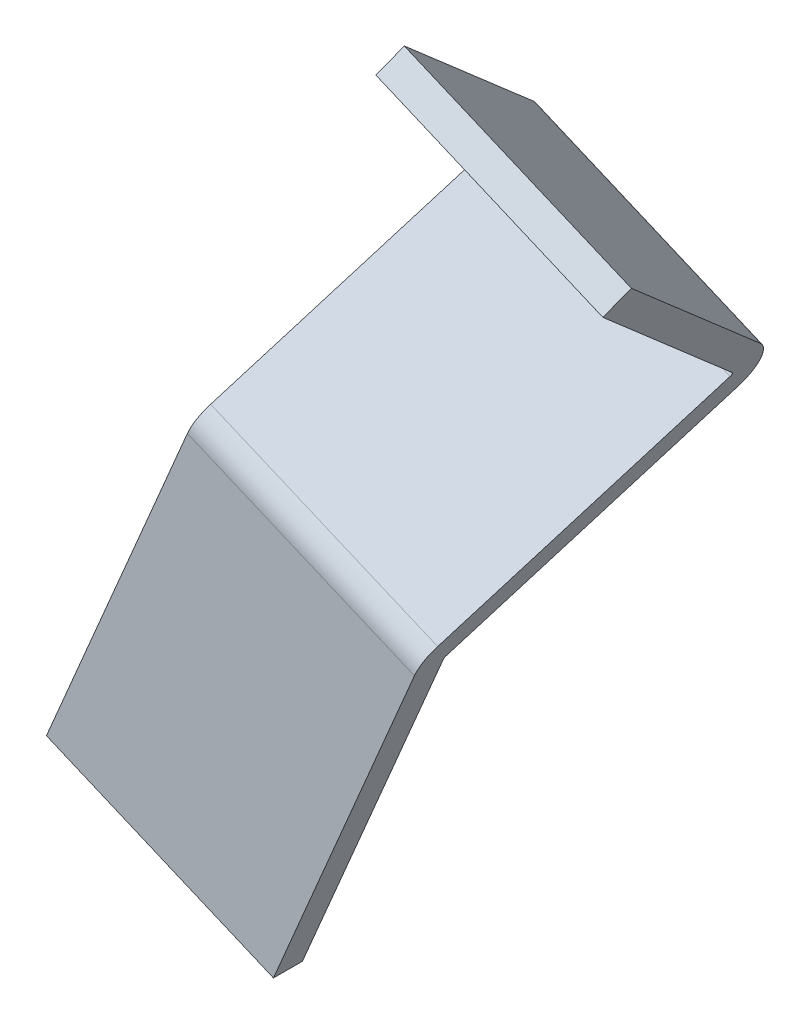
ISO-10303-21;
HEADER;
FILE_DESCRIPTION(('STEP AP214'),'2;1');
FILE_NAME('part.step','',(''),(''),'','','');
FILE_SCHEMA(('AUTOMOTIVE_DESIGN { 1 0 10303 214 1 1 1 1 }'));
ENDSEC;
DATA;
#1=APPLICATION_CONTEXT('core data for automotive mechanical design processes');
#2=APPLICATION_PROTOCOL_DEFINITION('international standard','automotive_design',2000,#1);
#3=PRODUCT_CONTEXT('',#1,'mechanical');
#4=PRODUCT('Part','Part','',(#3));
#5=PRODUCT_RELATED_PRODUCT_CATEGORY('part','',(#4));
#6=PRODUCT_DEFINITION_FORMATION('','',#4);
#7=PRODUCT_DEFINITION_CONTEXT('part definition',#1,'design');
#8=PRODUCT_DEFINITION('design','',#6,#7);
#9=PRODUCT_DEFINITION_SHAPE('','',#8);
#10=(LENGTH_UNIT() NAMED_UNIT(*) SI_UNIT(.MILLI.,.METRE.));
#11=(NAMED_UNIT(*) PLANE_ANGLE_UNIT() SI_UNIT($,.RADIAN.));
#12=(NAMED_UNIT(*) SI_UNIT($,.STERADIAN.) SOLID_ANGLE_UNIT());
#13=UNCERTAINTY_MEASURE_WITH_UNIT(LENGTH_MEASURE(1.E-05),#10,'distance_accuracy_value','');
#14=(GEOMETRIC_REPRESENTATION_CONTEXT(3) GLOBAL_UNCERTAINTY_ASSIGNED_CONTEXT((#13)) GLOBAL_UNIT_ASSIGNED_CONTEXT((#10,
#11,#12)) REPRESENTATION_CONTEXT('',''));
#15=CARTESIAN_POINT('',(0.,0.,0.));
#16=DIRECTION('',(0.,0.,1.));
#17=DIRECTION('',(1.,0.,0.));
#18=AXIS2_PLACEMENT_3D('',#15,#16,#17);
#19=CARTESIAN_POINT('',(31.5081880786191,28.9458657228669,-7.62197859128224));
#20=DIRECTION('',(-0.276231828199763,-0.650919332244334,0.707106781186552));
#21=DIRECTION('',(0.,-0.735733406737757,-0.677271256004605));
#22=AXIS2_PLACEMENT_3D('',#19,#20,#21);
#23=PLANE('',#22);
#24=DIRECTION('',(-0.27623182819976,-0.650919332244342,-0.707106781186546));
#25=VECTOR('',#24,1.);
#26=CARTESIAN_POINT('',(32.2424553181626,30.6761107289089,-5.74237859128224));
#27=LINE('',#26,#25);
#28=CARTESIAN_POINT('',(32.2424553181626,30.6761107289089,-5.74237859128223));
#29=VERTEX_POINT('',#28);
#30=CARTESIAN_POINT('',(31.5164030968905,28.9652237897573,-7.60094953331634));
#31=VERTEX_POINT('',#30);
#32=EDGE_CURVE('E105',#29,#31,#27,.T.);
#33=ORIENTED_EDGE('',*,*,#32,.F.);
#34=DIRECTION('',(-0.920538947670782,0.390650797799224,0.));
#35=VECTOR('',#34,1.);
#36=CARTESIAN_POINT('',(32.2424553181626,30.6761107289089,-5.74237859128223));
#37=LINE('',#36,#35);
#38=CARTESIAN_POINT('',(30.2550117301413,31.5195258013574,-5.74237859128224));
#39=VERTEX_POINT('',#38);
#40=EDGE_CURVE('E207',#29,#39,#37,.T.);
#41=ORIENTED_EDGE('',*,*,#40,.T.);
#42=DIRECTION('',(0.276231828199762,0.650919332244341,0.707106781186547));
#43=VECTOR('',#42,1.);
#44=CARTESIAN_POINT('',(29.5289595088692,29.8086388622058,-7.60094953331638));
#45=LINE('',#44,#43);
#46=CARTESIAN_POINT('',(29.5289595088692,29.8086388622058,-7.60094953331638));
#47=VERTEX_POINT('',#46);
#48=EDGE_CURVE('E213',#47,#39,#45,.T.);
#49=ORIENTED_EDGE('',*,*,#48,.F.);
#50=DIRECTION('',(-0.920538947670799,0.390650797799183,0.));
#51=VECTOR('',#50,1.);
#52=CARTESIAN_POINT('',(31.5164030968905,28.9652237897573,-7.60094953331632));
#53=LINE('',#52,#51);
#54=EDGE_CURVE('E288',#47,#31,#53,.F.);
#55=ORIENTED_EDGE('',*,*,#54,.T.);
#56=EDGE_LOOP('',(#33,#41,#49,#55));
#57=FACE_BOUND('',#56,.T.);
#58=ADVANCED_FACE('F17',(#57),#23,.T.);
#59=CARTESIAN_POINT('',(32.3126182025253,30.8414442392989,-5.92198371370362));
#60=DIRECTION('',(-0.276231828199762,-0.650919332244339,-0.707106781186549));
#61=DIRECTION('',(0.,0.735733406737752,-0.677271256004609));
#62=AXIS2_PLACEMENT_3D('',#59,#60,#61);
#63=PLANE('',#62);
#64=ORIENTED_EDGE('',*,*,#40,.F.);
#65=DIRECTION('',(-0.276231828199565,-0.650919332244425,0.707106781186546));
#66=VECTOR('',#65,1.);
#67=CARTESIAN_POINT('',(32.3126182025253,30.8414442392989,-5.92198371370362));
#68=LINE('',#67,#66);
#69=CARTESIAN_POINT('',(32.3126182025253,30.8414442392989,-5.92198371370362));
#70=VERTEX_POINT('',#69);
#71=EDGE_CURVE('E209',#70,#29,#68,.T.);
#72=ORIENTED_EDGE('',*,*,#71,.F.);
#73=DIRECTION('',(-0.920538947670783,0.39065079779922,0.));
#74=VECTOR('',#73,1.);
#75=CARTESIAN_POINT('',(32.3126182025253,30.8414442392989,-5.92198371370362));
#76=LINE('',#75,#74);
#77=CARTESIAN_POINT('',(30.3251746145041,31.6848593117474,-5.92198371370362));
#78=VERTEX_POINT('',#77);
#79=EDGE_CURVE('E277',#70,#78,#76,.T.);
#80=ORIENTED_EDGE('',*,*,#79,.T.);
#81=DIRECTION('',(0.276231828199764,0.650919332244325,-0.70710678118656));
#82=VECTOR('',#81,1.);
#83=CARTESIAN_POINT('',(30.2550117301413,31.5195258013574,-5.74237859128224));
#84=LINE('',#83,#82);
#85=EDGE_CURVE('E211',#39,#78,#84,.T.);
#86=ORIENTED_EDGE('',*,*,#85,.F.);
#87=EDGE_LOOP('',(#64,#72,#80,#86));
#88=FACE_BOUND('',#87,.T.);
#89=ADVANCED_FACE('F199',(#88),#63,.F.);
#90=CARTESIAN_POINT('',(31.5093868084542,28.9486904387183,-7.58298902107423));
#91=DIRECTION('',(-0.920538947670799,0.390650797799183,0.));
#92=DIRECTION('',(-0.390650797799183,-0.920538947670799,0.));
#93=AXIS2_PLACEMENT_3D('',#90,#91,#92);
#94=CYLINDRICAL_SURFACE('',#93,0.0253999999999994);
#95=DIRECTION('',(-0.920538947670784,0.390650797799217,0.));
#96=VECTOR('',#95,1.);
#97=CARTESIAN_POINT('',(31.5013593128433,28.9297742547409,-7.59791876648247));
#98=LINE('',#97,#96);
#99=CARTESIAN_POINT('',(31.5013593128434,28.9297742547409,-7.59791876648246));
#100=VERTEX_POINT('',#99);
#101=CARTESIAN_POINT('',(29.5139157248221,29.7731893271894,-7.59791876648247));
#102=VERTEX_POINT('',#101);
#103=EDGE_CURVE('E264',#100,#102,#98,.T.);
#104=ORIENTED_EDGE('',*,*,#103,.F.);
#105=CARTESIAN_POINT('',(31.5093868084542,28.9486904387182,-7.58298902107423));
#106=DIRECTION('',(-0.920538947670799,0.390650797799183,0.));
#107=DIRECTION('',(-0.390650797799183,-0.920538947670799,0.));
#108=AXIS2_PLACEMENT_3D('',#105,#106,#107);
#109=CIRCLE('',#108,0.0253999999999994);
#110=EDGE_CURVE('E20',#31,#100,#109,.T.);
#111=ORIENTED_EDGE('',*,*,#110,.F.);
#112=ORIENTED_EDGE('',*,*,#54,.F.);
#113=CARTESIAN_POINT('',(29.5219432204329,29.7921055111667,-7.58298902107423));
#114=DIRECTION('',(-0.920538947670799,0.390650797799183,0.));
#115=DIRECTION('',(-0.390650797799183,-0.920538947670799,0.));
#116=AXIS2_PLACEMENT_3D('',#113,#114,#115);
#117=CIRCLE('',#116,0.0253999999999994);
#118=EDGE_CURVE('E262',#102,#47,#117,.F.);
#119=ORIENTED_EDGE('',*,*,#118,.F.);
#120=EDGE_LOOP('',(#104,#111,#112,#119));
#121=FACE_BOUND('',#120,.T.);
#122=ADVANCED_FACE('F196',(#121),#94,.F.);
#123=CARTESIAN_POINT('',(31.5783509629819,29.1111992332569,-7.80158371370362));
#124=DIRECTION('',(-0.276231828199763,-0.650919332244334,0.707106781186552));
#125=DIRECTION('',(0.,-0.735733406737757,-0.677271256004605));
#126=AXIS2_PLACEMENT_3D('',#123,#124,#125);
#127=PLANE('',#126);
#128=ORIENTED_EDGE('',*,*,#79,.F.);
#129=DIRECTION('',(0.276231828199753,0.650919332244349,0.707106781186543));
#130=VECTOR('',#129,1.);
#131=CARTESIAN_POINT('',(31.5865659812532,29.1305573001473,-7.78055465573773));
#132=LINE('',#131,#130);
#133=CARTESIAN_POINT('',(31.5865659812532,29.1305573001473,-7.78055465573774));
#134=VERTEX_POINT('',#133);
#135=EDGE_CURVE('E217',#134,#70,#132,.T.);
#136=ORIENTED_EDGE('',*,*,#135,.F.);
#137=DIRECTION('',(-0.920538947670783,0.390650797799221,0.));
#138=VECTOR('',#137,1.);
#139=CARTESIAN_POINT('',(31.5865659812532,29.1305573001473,-7.78055465573775));
#140=LINE('',#139,#138);
#141=CARTESIAN_POINT('',(29.599122393232,29.9739723725958,-7.78055465573775));
#142=VERTEX_POINT('',#141);
#143=EDGE_CURVE('E258',#142,#134,#140,.F.);
#144=ORIENTED_EDGE('',*,*,#143,.F.);
#145=DIRECTION('',(-0.276231828199771,-0.650919332244341,-0.707106781186543));
#146=VECTOR('',#145,1.);
#147=CARTESIAN_POINT('',(30.3251746145041,31.6848593117474,-5.92198371370362));
#148=LINE('',#147,#146);
#149=EDGE_CURVE('E273',#78,#142,#148,.T.);
#150=ORIENTED_EDGE('',*,*,#149,.F.);
#151=EDGE_LOOP('',(#128,#136,#144,#150));
#152=FACE_BOUND('',#151,.T.);
#153=ADVANCED_FACE('F192',(#152),#127,.F.);
#154=CARTESIAN_POINT('',(30.9026202999469,27.5188912257897,-5.48837859128225));
#155=DIRECTION('',(0.316043134285696,0.744731652649689,0.587785252292482));
#156=DIRECTION('',(0.,-0.619539879072761,0.784965182819282));
#157=AXIS2_PLACEMENT_3D('',#154,#155,#156);
#158=PLANE('',#157);
#159=DIRECTION('',(-0.229618777742678,-0.541079217601728,0.809016994374939));
#160=VECTOR('',#159,1.);
#161=CARTESIAN_POINT('',(31.5013593128434,28.9297742547409,-7.59791876648246));
#162=LINE('',#161,#160);
#163=CARTESIAN_POINT('',(30.9353091530439,27.5959200264477,-5.60355139179172));
#164=VERTEX_POINT('',#163);
#165=EDGE_CURVE('E261',#100,#164,#162,.T.);
#166=ORIENTED_EDGE('',*,*,#165,.F.);
#167=ORIENTED_EDGE('',*,*,#103,.T.);
#168=DIRECTION('',(0.229618777742676,0.541079217601727,-0.809016994374941));
#169=VECTOR('',#168,1.);
#170=CARTESIAN_POINT('',(28.9478655650227,28.4393350988962,-5.60355139179173));
#171=LINE('',#170,#169);
#172=CARTESIAN_POINT('',(28.9478655650227,28.4393350988963,-5.60355139179173));
#173=VERTEX_POINT('',#172);
#174=EDGE_CURVE('E254',#173,#102,#171,.T.);
#175=ORIENTED_EDGE('',*,*,#174,.F.);
#176=DIRECTION('',(-0.920538947670783,0.390650797799221,0.));
#177=VECTOR('',#176,1.);
#178=CARTESIAN_POINT('',(30.935309153044,27.5959200264477,-5.60355139179173));
#179=LINE('',#178,#177);
#180=EDGE_CURVE('E250',#164,#173,#179,.T.);
#181=ORIENTED_EDGE('',*,*,#180,.F.);
#182=EDGE_LOOP('',(#166,#167,#175,#181));
#183=FACE_BOUND('',#182,.T.);
#184=ADVANCED_FACE('F188',(#183),#158,.T.);
#185=CARTESIAN_POINT('',(31.5093868084542,28.9486904387183,-7.58298902107423));
#186=DIRECTION('',(-0.920538947670783,0.390650797799221,0.));
#187=DIRECTION('',(-0.390650797799221,-0.920538947670783,0.));
#188=AXIS2_PLACEMENT_3D('',#185,#186,#187);
#189=CYLINDRICAL_SURFACE('',#188,0.279400000000002);
#190=CARTESIAN_POINT('',(31.5093868084542,28.9486904387182,-7.58298902107423));
#191=DIRECTION('',(-0.920538947670783,0.390650797799221,0.));
#192=DIRECTION('',(-0.390650797799221,-0.920538947670783,0.));
#193=AXIS2_PLACEMENT_3D('',#190,#191,#192);
#194=CIRCLE('',#193,0.279400000000002);
#195=CARTESIAN_POINT('',(31.4210843567348,28.7406124149679,-7.74721622056476));
#196=VERTEX_POINT('',#195);
#197=EDGE_CURVE('E255',#134,#196,#194,.T.);
#198=ORIENTED_EDGE('',*,*,#197,.T.);
#199=DIRECTION('',(-0.920538947670785,0.390650797799215,0.));
#200=VECTOR('',#199,1.);
#201=CARTESIAN_POINT('',(31.4210843567348,28.7406124149679,-7.74721622056477));
#202=LINE('',#201,#200);
#203=CARTESIAN_POINT('',(29.4336407687136,29.5840274874164,-7.74721622056476));
#204=VERTEX_POINT('',#203);
#205=EDGE_CURVE('E303',#196,#204,#202,.T.);
#206=ORIENTED_EDGE('',*,*,#205,.T.);
#207=CARTESIAN_POINT('',(29.521943220433,29.7921055111668,-7.58298902107423));
#208=DIRECTION('',(-0.920538947670783,0.390650797799221,0.));
#209=DIRECTION('',(-0.390650797799221,-0.920538947670783,0.));
#210=AXIS2_PLACEMENT_3D('',#207,#208,#209);
#211=CIRCLE('',#210,0.279400000000002);
#212=EDGE_CURVE('E259',#204,#142,#211,.F.);
#213=ORIENTED_EDGE('',*,*,#212,.T.);
#214=ORIENTED_EDGE('',*,*,#143,.T.);
#215=EDGE_LOOP('',(#198,#206,#213,#214));
#216=FACE_BOUND('',#215,.T.);
#217=ADVANCED_FACE('F184',(#216),#189,.T.);
#218=CARTESIAN_POINT('',(30.8470067013245,27.3878420026974,-5.76777859128224));
#219=DIRECTION('',(-0.920538947670783,0.390650797799221,0.));
#220=DIRECTION('',(-0.390650797799221,-0.920538947670783,0.));
#221=AXIS2_PLACEMENT_3D('',#218,#219,#220);
#222=CYLINDRICAL_SURFACE('',#221,0.279400000000002);
#223=CARTESIAN_POINT('',(30.8470067013245,27.3878420026974,-5.76777859128224));
#224=DIRECTION('',(-0.920538947670783,0.390650797799221,0.));
#225=DIRECTION('',(-0.390650797799221,-0.920538947670783,0.));
#226=AXIS2_PLACEMENT_3D('',#223,#224,#225);
#227=CIRCLE('',#226,0.279400000000002);
#228=CARTESIAN_POINT('',(30.8470067013245,27.3878420026974,-5.48837859128225));
#229=VERTEX_POINT('',#228);
#230=EDGE_CURVE('E246',#164,#229,#227,.F.);
#231=ORIENTED_EDGE('',*,*,#230,.F.);
#232=ORIENTED_EDGE('',*,*,#180,.T.);
#233=CARTESIAN_POINT('',(28.8595631133033,28.2312570751459,-5.76777859128224));
#234=DIRECTION('',(-0.920538947670783,0.390650797799221,0.));
#235=DIRECTION('',(-0.390650797799221,-0.920538947670783,0.));
#236=AXIS2_PLACEMENT_3D('',#233,#234,#235);
#237=CIRCLE('',#236,0.279400000000002);
#238=CARTESIAN_POINT('',(28.8595631133033,28.2312570751459,-5.48837859128225));
#239=VERTEX_POINT('',#238);
#240=EDGE_CURVE('E251',#173,#239,#237,.F.);
#241=ORIENTED_EDGE('',*,*,#240,.T.);
#242=DIRECTION('',(-0.920538947670793,0.390650797799196,0.));
#243=VECTOR('',#242,1.);
#244=CARTESIAN_POINT('',(30.8470067013245,27.3878420026975,-5.48837859128225));
#245=LINE('',#244,#243);
#246=EDGE_CURVE('E310',#229,#239,#245,.T.);
#247=ORIENTED_EDGE('',*,*,#246,.F.);
#248=EDGE_LOOP('',(#231,#232,#241,#247));
#249=FACE_BOUND('',#248,.T.);
#250=ADVANCED_FACE('F180',(#249),#222,.T.);
#251=CARTESIAN_POINT('',(30.8223453438383,27.3297293860167,-5.63767604536454));
#252=DIRECTION('',(0.316043134285696,0.744731652649689,0.587785252292482));
#253=DIRECTION('',(0.,-0.619539879072761,0.784965182819282));
#254=AXIS2_PLACEMENT_3D('',#251,#252,#253);
#255=PLANE('',#254);
#256=ORIENTED_EDGE('',*,*,#205,.F.);
#257=DIRECTION('',(0.229618777742678,0.541079217601725,-0.809016994374941));
#258=VECTOR('',#257,1.);
#259=CARTESIAN_POINT('',(30.8550341969354,27.4067581866747,-5.75284884587403));
#260=LINE('',#259,#258);
#261=CARTESIAN_POINT('',(30.8550341969354,27.4067581866747,-5.75284884587402));
#262=VERTEX_POINT('',#261);
#263=EDGE_CURVE('E249',#262,#196,#260,.T.);
#264=ORIENTED_EDGE('',*,*,#263,.F.);
#265=DIRECTION('',(-0.920538947670799,0.390650797799183,0.));
#266=VECTOR('',#265,1.);
#267=CARTESIAN_POINT('',(30.8550341969354,27.4067581866747,-5.75284884587404));
#268=LINE('',#267,#266);
#269=CARTESIAN_POINT('',(28.8675906089141,28.2501732591232,-5.75284884587402));
#270=VERTEX_POINT('',#269);
#271=EDGE_CURVE('E240',#262,#270,#268,.T.);
#272=ORIENTED_EDGE('',*,*,#271,.T.);
#273=DIRECTION('',(-0.229618777742679,-0.541079217601725,0.809016994374941));
#274=VECTOR('',#273,1.);
#275=CARTESIAN_POINT('',(29.4336407687135,29.5840274874164,-7.74721622056476));
#276=LINE('',#275,#274);
#277=EDGE_CURVE('E322',#204,#270,#276,.T.);
#278=ORIENTED_EDGE('',*,*,#277,.F.);
#279=EDGE_LOOP('',(#256,#264,#272,#278));
#280=FACE_BOUND('',#279,.T.);
#281=ADVANCED_FACE('F176',(#280),#255,.F.);
#282=CARTESIAN_POINT('',(30.9026202999469,27.5188912257897,-5.48837859128225));
#283=DIRECTION('',(0.,0.,1.));
#284=DIRECTION('',(1.,0.,0.));
#285=AXIS2_PLACEMENT_3D('',#282,#283,#284);
#286=PLANE('',#285);
#287=DIRECTION('',(-0.390650797799221,-0.920538947670783,0.));
#288=VECTOR('',#287,1.);
#289=CARTESIAN_POINT('',(31.5093868084542,28.9486904387183,-5.48837859128226));
#290=LINE('',#289,#288);
#291=CARTESIAN_POINT('',(29.6126913656138,24.4792716205808,-5.48837859128226));
#292=VERTEX_POINT('',#291);
#293=EDGE_CURVE('E245',#292,#229,#290,.F.);
#294=ORIENTED_EDGE('',*,*,#293,.T.);
#295=ORIENTED_EDGE('',*,*,#246,.T.);
#296=DIRECTION('',(-0.390650797799221,-0.920538947670783,0.));
#297=VECTOR('',#296,1.);
#298=CARTESIAN_POINT('',(28.8675906089141,28.2501732591233,-5.48837859128226));
#299=LINE('',#298,#297);
#300=CARTESIAN_POINT('',(27.6252477775926,25.3226866930293,-5.48837859128226));
#301=VERTEX_POINT('',#300);
#302=EDGE_CURVE('E153',#301,#239,#299,.F.);
#303=ORIENTED_EDGE('',*,*,#302,.F.);
#304=DIRECTION('',(-0.920538947670783,0.390650797799221,0.));
#305=VECTOR('',#304,1.);
#306=CARTESIAN_POINT('',(29.6126913656138,24.4792716205808,-5.48837859128226));
#307=LINE('',#306,#305);
#308=EDGE_CURVE('E149',#301,#292,#307,.F.);
#309=ORIENTED_EDGE('',*,*,#308,.T.);
#310=EDGE_LOOP('',(#294,#295,#303,#309));
#311=FACE_BOUND('',#310,.T.);
#312=ADVANCED_FACE('F173',(#311),#286,.T.);
#313=CARTESIAN_POINT('',(29.6126913656138,24.4792716205808,-5.48837859128226));
#314=DIRECTION('',(0.390650797799221,0.920538947670783,0.));
#315=DIRECTION('',(-0.920538947670783,0.390650797799221,0.));
#316=AXIS2_PLACEMENT_3D('',#313,#314,#315);
#317=PLANE('',#316);
#318=DIRECTION('',(0.920538947670779,-0.390650797799229,0.));
#319=VECTOR('',#318,1.);
#320=CARTESIAN_POINT('',(27.6252477775926,25.3226866930293,-5.74237859128227));
#321=LINE('',#320,#319);
#322=CARTESIAN_POINT('',(27.6252477775926,25.3226866930293,-5.74237859128226));
#323=VERTEX_POINT('',#322);
#324=CARTESIAN_POINT('',(29.6126913656138,24.4792716205808,-5.74237859128226));
#325=VERTEX_POINT('',#324);
#326=EDGE_CURVE('E135',#323,#325,#321,.T.);
#327=ORIENTED_EDGE('',*,*,#326,.T.);
#328=DIRECTION('',(0.,0.,1.));
#329=VECTOR('',#328,1.);
#330=CARTESIAN_POINT('',(29.6126913656138,24.4792716205808,-7.58298902107423));
#331=LINE('',#330,#329);
#332=EDGE_CURVE('E305',#325,#292,#331,.T.);
#333=ORIENTED_EDGE('',*,*,#332,.T.);
#334=ORIENTED_EDGE('',*,*,#308,.F.);
#335=DIRECTION('',(0.,0.,1.));
#336=VECTOR('',#335,1.);
#337=CARTESIAN_POINT('',(27.6252477775926,25.3226866930293,-5.75284884587402));
#338=LINE('',#337,#336);
#339=EDGE_CURVE('E145',#323,#301,#338,.T.);
#340=ORIENTED_EDGE('',*,*,#339,.F.);
#341=EDGE_LOOP('',(#327,#333,#334,#340));
#342=FACE_BOUND('',#341,.T.);
#343=ADVANCED_FACE('F148',(#342),#317,.F.);
#344=CARTESIAN_POINT('',(31.5093868084542,28.9486904387183,-7.58298902107423));
#345=DIRECTION('',(-0.920538947670783,0.390650797799221,0.));
#346=DIRECTION('',(-0.390650797799221,-0.920538947670783,0.));
#347=AXIS2_PLACEMENT_3D('',#344,#345,#346);
#348=PLANE('',#347);
#349=DIRECTION('',(0.390650797799215,0.920538947670785,0.));
#350=VECTOR('',#349,1.);
#351=CARTESIAN_POINT('',(29.6126913656139,24.4792716205808,-5.74237859128226));
#352=LINE('',#351,#350);
#353=CARTESIAN_POINT('',(30.8470067013245,27.3878420026974,-5.74237859128224));
#354=VERTEX_POINT('',#353);
#355=EDGE_CURVE('E141',#325,#354,#352,.T.);
#356=ORIENTED_EDGE('',*,*,#355,.T.);
#357=CARTESIAN_POINT('',(30.8470067013245,27.3878420026974,-5.76777859128224));
#358=DIRECTION('',(-0.920538947670799,0.390650797799183,0.));
#359=DIRECTION('',(-0.390650797799183,-0.920538947670799,0.));
#360=AXIS2_PLACEMENT_3D('',#357,#358,#359);
#361=CIRCLE('',#360,0.0253999999999994);
#362=EDGE_CURVE('E241',#354,#262,#361,.T.);
#363=ORIENTED_EDGE('',*,*,#362,.T.);
#364=ORIENTED_EDGE('',*,*,#263,.T.);
#365=ORIENTED_EDGE('',*,*,#197,.F.);
#366=ORIENTED_EDGE('',*,*,#135,.T.);
#367=ORIENTED_EDGE('',*,*,#71,.T.);
#368=ORIENTED_EDGE('',*,*,#32,.T.);
#369=ORIENTED_EDGE('',*,*,#110,.T.);
#370=ORIENTED_EDGE('',*,*,#165,.T.);
#371=ORIENTED_EDGE('',*,*,#230,.T.);
#372=ORIENTED_EDGE('',*,*,#293,.F.);
#373=ORIENTED_EDGE('',*,*,#332,.F.);
#374=EDGE_LOOP('',(#356,#363,#364,#365,#366,#367,#368,#369,#370,#371,#372,#373));
#375=FACE_BOUND('',#374,.T.);
#376=ADVANCED_FACE('F165',(#375),#348,.F.);
#377=CARTESIAN_POINT('',(30.8470067013245,27.3878420026974,-5.76777859128224));
#378=DIRECTION('',(-0.920538947670799,0.390650797799183,0.));
#379=DIRECTION('',(-0.390650797799183,-0.920538947670799,0.));
#380=AXIS2_PLACEMENT_3D('',#377,#378,#379);
#381=CYLINDRICAL_SURFACE('',#380,0.0253999999999994);
#382=ORIENTED_EDGE('',*,*,#271,.F.);
#383=ORIENTED_EDGE('',*,*,#362,.F.);
#384=DIRECTION('',(-0.92053894767078,0.390650797799227,0.));
#385=VECTOR('',#384,1.);
#386=CARTESIAN_POINT('',(30.8470067013245,27.3878420026974,-5.74237859128225));
#387=LINE('',#386,#385);
#388=CARTESIAN_POINT('',(28.8595631133033,28.2312570751459,-5.74237859128226));
#389=VERTEX_POINT('',#388);
#390=EDGE_CURVE('E27',#354,#389,#387,.T.);
#391=ORIENTED_EDGE('',*,*,#390,.T.);
#392=CARTESIAN_POINT('',(28.8595631133033,28.2312570751459,-5.76777859128224));
#393=DIRECTION('',(-0.920538947670799,0.390650797799183,0.));
#394=DIRECTION('',(-0.390650797799183,-0.920538947670799,0.));
#395=AXIS2_PLACEMENT_3D('',#392,#393,#394);
#396=CIRCLE('',#395,0.0253999999999994);
#397=EDGE_CURVE('E39',#270,#389,#396,.F.);
#398=ORIENTED_EDGE('',*,*,#397,.F.);
#399=EDGE_LOOP('',(#382,#383,#391,#398));
#400=FACE_BOUND('',#399,.T.);
#401=ADVANCED_FACE('F157',(#400),#381,.F.);
#402=CARTESIAN_POINT('',(28.8675906089141,28.2501732591233,-5.75284884587402));
#403=DIRECTION('',(-0.920538947670783,0.390650797799221,0.));
#404=DIRECTION('',(-0.390650797799221,-0.920538947670783,0.));
#405=AXIS2_PLACEMENT_3D('',#402,#403,#404);
#406=PLANE('',#405);
#407=DIRECTION('',(-0.390650797799215,-0.920538947670785,0.));
#408=VECTOR('',#407,1.);
#409=CARTESIAN_POINT('',(28.8595631133033,28.2312570751459,-5.74237859128226));
#410=LINE('',#409,#408);
#411=EDGE_CURVE('E11',#389,#323,#410,.T.);
#412=ORIENTED_EDGE('',*,*,#411,.T.);
#413=ORIENTED_EDGE('',*,*,#339,.T.);
#414=ORIENTED_EDGE('',*,*,#302,.T.);
#415=ORIENTED_EDGE('',*,*,#240,.F.);
#416=ORIENTED_EDGE('',*,*,#174,.T.);
#417=ORIENTED_EDGE('',*,*,#118,.T.);
#418=ORIENTED_EDGE('',*,*,#48,.T.);
#419=ORIENTED_EDGE('',*,*,#85,.T.);
#420=ORIENTED_EDGE('',*,*,#149,.T.);
#421=ORIENTED_EDGE('',*,*,#212,.F.);
#422=ORIENTED_EDGE('',*,*,#277,.T.);
#423=ORIENTED_EDGE('',*,*,#397,.T.);
#424=EDGE_LOOP('',(#412,#413,#414,#415,#416,#417,#418,#419,#420,#421,#422,#423));
#425=FACE_BOUND('',#424,.T.);
#426=ADVANCED_FACE('F155',(#425),#406,.T.);
#427=CARTESIAN_POINT('',(30.9026202999469,27.5188912257897,-5.74237859128225));
#428=DIRECTION('',(0.,0.,1.));
#429=DIRECTION('',(1.,0.,0.));
#430=AXIS2_PLACEMENT_3D('',#427,#428,#429);
#431=PLANE('',#430);
#432=ORIENTED_EDGE('',*,*,#390,.F.);
#433=ORIENTED_EDGE('',*,*,#355,.F.);
#434=ORIENTED_EDGE('',*,*,#326,.F.);
#435=ORIENTED_EDGE('',*,*,#411,.F.);
#436=EDGE_LOOP('',(#432,#433,#434,#435));
#437=FACE_BOUND('',#436,.T.);
#438=ADVANCED_FACE('F138',(#437),#431,.F.);
#439=CLOSED_SHELL('',(#58,#89,#122,#153,#184,#217,#250,#281,#312,#343,#376,#401,#426,#438));
#440=MANIFOLD_SOLID_BREP('B1',#439);
#441=ADVANCED_BREP_SHAPE_REPRESENTATION('',(#18,#440),#14);
#442=SHAPE_DEFINITION_REPRESENTATION(#9,#441);
ENDSEC;
END-ISO-10303-21;
